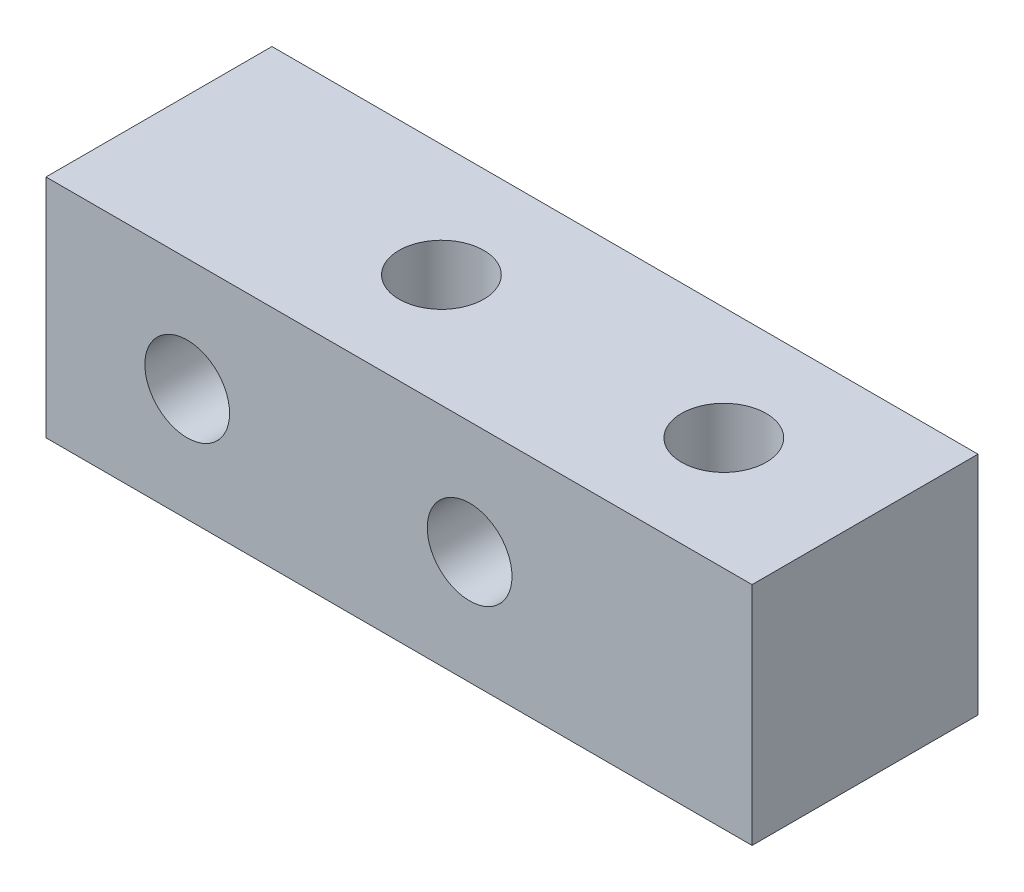
ISO-10303-21;
HEADER;
FILE_DESCRIPTION(('STEP AP214'),'2;1');
FILE_NAME('part.step','',(''),(''),'','','');
FILE_SCHEMA(('AUTOMOTIVE_DESIGN { 1 0 10303 214 1 1 1 1 }'));
ENDSEC;
DATA;
#1=APPLICATION_CONTEXT('core data for automotive mechanical design processes');
#2=APPLICATION_PROTOCOL_DEFINITION('international standard','automotive_design',2000,#1);
#3=PRODUCT_CONTEXT('',#1,'mechanical');
#4=PRODUCT('Part','Part','',(#3));
#5=PRODUCT_RELATED_PRODUCT_CATEGORY('part','',(#4));
#6=PRODUCT_DEFINITION_FORMATION('','',#4);
#7=PRODUCT_DEFINITION_CONTEXT('part definition',#1,'design');
#8=PRODUCT_DEFINITION('design','',#6,#7);
#9=PRODUCT_DEFINITION_SHAPE('','',#8);
#10=(LENGTH_UNIT() NAMED_UNIT(*) SI_UNIT(.MILLI.,.METRE.));
#11=(NAMED_UNIT(*) PLANE_ANGLE_UNIT() SI_UNIT($,.RADIAN.));
#12=(NAMED_UNIT(*) SI_UNIT($,.STERADIAN.) SOLID_ANGLE_UNIT());
#13=UNCERTAINTY_MEASURE_WITH_UNIT(LENGTH_MEASURE(1.E-05),#10,'distance_accuracy_value','');
#14=(GEOMETRIC_REPRESENTATION_CONTEXT(3) GLOBAL_UNCERTAINTY_ASSIGNED_CONTEXT((#13)) GLOBAL_UNIT_ASSIGNED_CONTEXT((#10,
#11,#12)) REPRESENTATION_CONTEXT('',''));
#15=CARTESIAN_POINT('',(0.,0.,0.));
#16=DIRECTION('',(0.,0.,1.));
#17=DIRECTION('',(1.,0.,0.));
#18=AXIS2_PLACEMENT_3D('',#15,#16,#17);
#19=CARTESIAN_POINT('',(12.5,8.,4.));
#20=DIRECTION('',(-1.,0.,0.));
#21=DIRECTION('',(0.,0.,1.));
#22=AXIS2_PLACEMENT_3D('',#19,#20,#21);
#23=PLANE('',#22);
#24=DIRECTION('',(0.,0.,-1.));
#25=VECTOR('',#24,1.);
#26=CARTESIAN_POINT('',(12.5,0.,4.));
#27=LINE('',#26,#25);
#28=CARTESIAN_POINT('',(12.5,0.,4.));
#29=VERTEX_POINT('',#28);
#30=CARTESIAN_POINT('',(12.5,0.,-4.));
#31=VERTEX_POINT('',#30);
#32=EDGE_CURVE('E110',#29,#31,#27,.T.);
#33=ORIENTED_EDGE('',*,*,#32,.T.);
#34=DIRECTION('',(0.,-1.,0.));
#35=VECTOR('',#34,1.);
#36=CARTESIAN_POINT('',(12.5,8.,-4.));
#37=LINE('',#36,#35);
#38=CARTESIAN_POINT('',(12.5,8.,-4.));
#39=VERTEX_POINT('',#38);
#40=EDGE_CURVE('E11',#39,#31,#37,.T.);
#41=ORIENTED_EDGE('',*,*,#40,.F.);
#42=DIRECTION('',(0.,0.,-1.));
#43=VECTOR('',#42,1.);
#44=CARTESIAN_POINT('',(12.5,8.,4.));
#45=LINE('',#44,#43);
#46=CARTESIAN_POINT('',(12.5,8.,4.));
#47=VERTEX_POINT('',#46);
#48=EDGE_CURVE('E94',#47,#39,#45,.T.);
#49=ORIENTED_EDGE('',*,*,#48,.F.);
#50=DIRECTION('',(0.,-1.,0.));
#51=VECTOR('',#50,1.);
#52=CARTESIAN_POINT('',(12.5,8.,4.));
#53=LINE('',#52,#51);
#54=EDGE_CURVE('E106',#47,#29,#53,.T.);
#55=ORIENTED_EDGE('',*,*,#54,.T.);
#56=EDGE_LOOP('',(#33,#41,#49,#55));
#57=FACE_BOUND('',#56,.T.);
#58=ADVANCED_FACE('F42',(#57),#23,.F.);
#59=CARTESIAN_POINT('',(-12.5,8.,-4.));
#60=DIRECTION('',(0.,0.,1.));
#61=DIRECTION('',(1.,0.,0.));
#62=AXIS2_PLACEMENT_3D('',#59,#60,#61);
#63=PLANE('',#62);
#64=CARTESIAN_POINT('',(-7.5,4.,-4.));
#65=DIRECTION('',(0.,0.,1.));
#66=DIRECTION('',(1.,0.,0.));
#67=AXIS2_PLACEMENT_3D('',#64,#65,#66);
#68=CIRCLE('',#67,1.5);
#69=CARTESIAN_POINT('',(-6.,4.,-4.));
#70=VERTEX_POINT('',#69);
#71=EDGE_CURVE('E140',#70,#70,#68,.F.);
#72=ORIENTED_EDGE('',*,*,#71,.F.);
#73=EDGE_LOOP('',(#72));
#74=FACE_BOUND('',#73,.T.);
#75=CARTESIAN_POINT('',(2.5,4.,-4.));
#76=DIRECTION('',(0.,0.,1.));
#77=DIRECTION('',(1.,0.,0.));
#78=AXIS2_PLACEMENT_3D('',#75,#76,#77);
#79=CIRCLE('',#78,1.5);
#80=CARTESIAN_POINT('',(4.,4.,-4.));
#81=VERTEX_POINT('',#80);
#82=EDGE_CURVE('E152',#81,#81,#79,.F.);
#83=ORIENTED_EDGE('',*,*,#82,.F.);
#84=EDGE_LOOP('',(#83));
#85=FACE_BOUND('',#84,.T.);
#86=DIRECTION('',(-1.,0.,0.));
#87=VECTOR('',#86,1.);
#88=CARTESIAN_POINT('',(-12.5,0.,-4.));
#89=LINE('',#88,#87);
#90=CARTESIAN_POINT('',(-12.5,0.,-4.));
#91=VERTEX_POINT('',#90);
#92=EDGE_CURVE('E99',#31,#91,#89,.T.);
#93=ORIENTED_EDGE('',*,*,#92,.T.);
#94=DIRECTION('',(0.,-1.,0.));
#95=VECTOR('',#94,1.);
#96=CARTESIAN_POINT('',(-12.5,8.,-4.));
#97=LINE('',#96,#95);
#98=CARTESIAN_POINT('',(-12.5,8.,-4.));
#99=VERTEX_POINT('',#98);
#100=EDGE_CURVE('E51',#99,#91,#97,.T.);
#101=ORIENTED_EDGE('',*,*,#100,.F.);
#102=DIRECTION('',(-1.,0.,0.));
#103=VECTOR('',#102,1.);
#104=CARTESIAN_POINT('',(-12.5,8.,-4.));
#105=LINE('',#104,#103);
#106=EDGE_CURVE('E89',#39,#99,#105,.T.);
#107=ORIENTED_EDGE('',*,*,#106,.F.);
#108=ORIENTED_EDGE('',*,*,#40,.T.);
#109=EDGE_LOOP('',(#93,#101,#107,#108));
#110=FACE_BOUND('',#109,.T.);
#111=ADVANCED_FACE('F98',(#74,#85,#110),#63,.F.);
#112=CARTESIAN_POINT('',(-12.5,8.,4.));
#113=DIRECTION('',(1.,0.,0.));
#114=DIRECTION('',(0.,0.,-1.));
#115=AXIS2_PLACEMENT_3D('',#112,#113,#114);
#116=PLANE('',#115);
#117=DIRECTION('',(0.,0.,1.));
#118=VECTOR('',#117,1.);
#119=CARTESIAN_POINT('',(-12.5,0.,4.));
#120=LINE('',#119,#118);
#121=CARTESIAN_POINT('',(-12.5,0.,4.));
#122=VERTEX_POINT('',#121);
#123=EDGE_CURVE('E76',#91,#122,#120,.T.);
#124=ORIENTED_EDGE('',*,*,#123,.T.);
#125=DIRECTION('',(0.,-1.,0.));
#126=VECTOR('',#125,1.);
#127=CARTESIAN_POINT('',(-12.5,8.,4.));
#128=LINE('',#127,#126);
#129=CARTESIAN_POINT('',(-12.5,8.,4.));
#130=VERTEX_POINT('',#129);
#131=EDGE_CURVE('E101',#130,#122,#128,.T.);
#132=ORIENTED_EDGE('',*,*,#131,.F.);
#133=DIRECTION('',(0.,0.,1.));
#134=VECTOR('',#133,1.);
#135=CARTESIAN_POINT('',(-12.5,8.,4.));
#136=LINE('',#135,#134);
#137=EDGE_CURVE('E92',#99,#130,#136,.T.);
#138=ORIENTED_EDGE('',*,*,#137,.F.);
#139=ORIENTED_EDGE('',*,*,#100,.T.);
#140=EDGE_LOOP('',(#124,#132,#138,#139));
#141=FACE_BOUND('',#140,.T.);
#142=ADVANCED_FACE('F102',(#141),#116,.F.);
#143=CARTESIAN_POINT('',(-12.5,8.,4.));
#144=DIRECTION('',(0.,0.,-1.));
#145=DIRECTION('',(-1.,0.,0.));
#146=AXIS2_PLACEMENT_3D('',#143,#144,#145);
#147=PLANE('',#146);
#148=CARTESIAN_POINT('',(-7.5,4.,4.));
#149=DIRECTION('',(0.,0.,1.));
#150=DIRECTION('',(1.,0.,0.));
#151=AXIS2_PLACEMENT_3D('',#148,#149,#150);
#152=CIRCLE('',#151,1.5);
#153=CARTESIAN_POINT('',(-6.,4.,4.));
#154=VERTEX_POINT('',#153);
#155=EDGE_CURVE('E151',#154,#154,#152,.T.);
#156=ORIENTED_EDGE('',*,*,#155,.F.);
#157=EDGE_LOOP('',(#156));
#158=FACE_BOUND('',#157,.T.);
#159=CARTESIAN_POINT('',(2.5,4.,4.));
#160=DIRECTION('',(0.,0.,1.));
#161=DIRECTION('',(1.,0.,0.));
#162=AXIS2_PLACEMENT_3D('',#159,#160,#161);
#163=CIRCLE('',#162,1.5);
#164=CARTESIAN_POINT('',(4.,4.,4.));
#165=VERTEX_POINT('',#164);
#166=EDGE_CURVE('E147',#165,#165,#163,.T.);
#167=ORIENTED_EDGE('',*,*,#166,.F.);
#168=EDGE_LOOP('',(#167));
#169=FACE_BOUND('',#168,.T.);
#170=DIRECTION('',(1.,0.,0.));
#171=VECTOR('',#170,1.);
#172=CARTESIAN_POINT('',(-12.5,0.,4.));
#173=LINE('',#172,#171);
#174=EDGE_CURVE('E82',#122,#29,#173,.T.);
#175=ORIENTED_EDGE('',*,*,#174,.T.);
#176=ORIENTED_EDGE('',*,*,#54,.F.);
#177=DIRECTION('',(1.,0.,0.));
#178=VECTOR('',#177,1.);
#179=CARTESIAN_POINT('',(-12.5,8.,4.));
#180=LINE('',#179,#178);
#181=EDGE_CURVE('E59',#130,#47,#180,.T.);
#182=ORIENTED_EDGE('',*,*,#181,.F.);
#183=ORIENTED_EDGE('',*,*,#131,.T.);
#184=EDGE_LOOP('',(#175,#176,#182,#183));
#185=FACE_BOUND('',#184,.T.);
#186=ADVANCED_FACE('F124',(#158,#169,#185),#147,.F.);
#187=CARTESIAN_POINT('',(0.,8.,0.));
#188=DIRECTION('',(0.,-1.,0.));
#189=DIRECTION('',(0.,0.,-1.));
#190=AXIS2_PLACEMENT_3D('',#187,#188,#189);
#191=PLANE('',#190);
#192=CARTESIAN_POINT('',(7.5,8.,0.));
#193=DIRECTION('',(0.,1.,0.));
#194=DIRECTION('',(0.,0.,1.));
#195=AXIS2_PLACEMENT_3D('',#192,#193,#194);
#196=CIRCLE('',#195,1.5);
#197=CARTESIAN_POINT('',(7.5,8.,1.5));
#198=VERTEX_POINT('',#197);
#199=EDGE_CURVE('E135',#198,#198,#196,.T.);
#200=ORIENTED_EDGE('',*,*,#199,.F.);
#201=EDGE_LOOP('',(#200));
#202=FACE_BOUND('',#201,.T.);
#203=CARTESIAN_POINT('',(-2.5,8.,0.));
#204=DIRECTION('',(0.,1.,0.));
#205=DIRECTION('',(0.,0.,1.));
#206=AXIS2_PLACEMENT_3D('',#203,#204,#205);
#207=CIRCLE('',#206,1.5);
#208=CARTESIAN_POINT('',(-2.5,8.,1.5));
#209=VERTEX_POINT('',#208);
#210=EDGE_CURVE('E131',#209,#209,#207,.T.);
#211=ORIENTED_EDGE('',*,*,#210,.F.);
#212=EDGE_LOOP('',(#211));
#213=FACE_BOUND('',#212,.T.);
#214=ORIENTED_EDGE('',*,*,#48,.T.);
#215=ORIENTED_EDGE('',*,*,#106,.T.);
#216=ORIENTED_EDGE('',*,*,#137,.T.);
#217=ORIENTED_EDGE('',*,*,#181,.T.);
#218=EDGE_LOOP('',(#214,#215,#216,#217));
#219=FACE_BOUND('',#218,.T.);
#220=ADVANCED_FACE('F90',(#202,#213,#219),#191,.F.);
#221=CARTESIAN_POINT('',(0.,0.,0.));
#222=DIRECTION('',(0.,-1.,0.));
#223=DIRECTION('',(0.,0.,-1.));
#224=AXIS2_PLACEMENT_3D('',#221,#222,#223);
#225=PLANE('',#224);
#226=CARTESIAN_POINT('',(7.5,0.,0.));
#227=DIRECTION('',(0.,-1.,0.));
#228=DIRECTION('',(0.,0.,-1.));
#229=AXIS2_PLACEMENT_3D('',#226,#227,#228);
#230=CIRCLE('',#229,1.5);
#231=CARTESIAN_POINT('',(7.5,0.,1.5));
#232=VERTEX_POINT('',#231);
#233=EDGE_CURVE('E114',#232,#232,#230,.F.);
#234=ORIENTED_EDGE('',*,*,#233,.T.);
#235=EDGE_LOOP('',(#234));
#236=FACE_BOUND('',#235,.T.);
#237=CARTESIAN_POINT('',(-2.5,0.,0.));
#238=DIRECTION('',(0.,-1.,0.));
#239=DIRECTION('',(0.,0.,-1.));
#240=AXIS2_PLACEMENT_3D('',#237,#238,#239);
#241=CIRCLE('',#240,1.5);
#242=CARTESIAN_POINT('',(-2.5,0.,1.5));
#243=VERTEX_POINT('',#242);
#244=EDGE_CURVE('E136',#243,#243,#241,.F.);
#245=ORIENTED_EDGE('',*,*,#244,.T.);
#246=EDGE_LOOP('',(#245));
#247=FACE_BOUND('',#246,.T.);
#248=ORIENTED_EDGE('',*,*,#32,.F.);
#249=ORIENTED_EDGE('',*,*,#174,.F.);
#250=ORIENTED_EDGE('',*,*,#123,.F.);
#251=ORIENTED_EDGE('',*,*,#92,.F.);
#252=EDGE_LOOP('',(#248,#249,#250,#251));
#253=FACE_BOUND('',#252,.T.);
#254=ADVANCED_FACE('F127',(#236,#247,#253),#225,.T.);
#255=CARTESIAN_POINT('',(-2.5,-4.24264068711929,0.));
#256=DIRECTION('',(0.,1.,0.));
#257=DIRECTION('',(0.,0.,1.));
#258=AXIS2_PLACEMENT_3D('',#255,#256,#257);
#259=CYLINDRICAL_SURFACE('',#258,1.5);
#260=CARTESIAN_POINT('',(-2.5,8.,1.5));
#261=CARTESIAN_POINT('',(-2.5,7.91666666666667,1.5));
#262=CARTESIAN_POINT('',(-2.5,7.83333333333333,1.5));
#263=CARTESIAN_POINT('',(-2.5,7.66666666666666,1.5));
#264=CARTESIAN_POINT('',(-2.5,7.58333333333333,1.5));
#265=CARTESIAN_POINT('',(-2.5,7.41666666666666,1.5));
#266=CARTESIAN_POINT('',(-2.5,7.33333333333333,1.5));
#267=CARTESIAN_POINT('',(-2.5,7.16666666666667,1.5));
#268=CARTESIAN_POINT('',(-2.5,7.08333333333333,1.5));
#269=CARTESIAN_POINT('',(-2.5,6.91666666666667,1.5));
#270=CARTESIAN_POINT('',(-2.5,6.83333333333333,1.5));
#271=CARTESIAN_POINT('',(-2.5,6.66666666666667,1.5));
#272=CARTESIAN_POINT('',(-2.5,6.58333333333333,1.5));
#273=CARTESIAN_POINT('',(-2.5,6.41666666666667,1.5));
#274=CARTESIAN_POINT('',(-2.5,6.33333333333333,1.5));
#275=CARTESIAN_POINT('',(-2.5,6.16666666666667,1.5));
#276=CARTESIAN_POINT('',(-2.5,6.08333333333333,1.5));
#277=CARTESIAN_POINT('',(-2.5,5.91666666666667,1.5));
#278=CARTESIAN_POINT('',(-2.5,5.83333333333333,1.5));
#279=CARTESIAN_POINT('',(-2.5,5.66666666666667,1.5));
#280=CARTESIAN_POINT('',(-2.5,5.58333333333333,1.5));
#281=CARTESIAN_POINT('',(-2.5,5.41666666666667,1.5));
#282=CARTESIAN_POINT('',(-2.5,5.33333333333333,1.5));
#283=CARTESIAN_POINT('',(-2.5,5.16666666666667,1.5));
#284=CARTESIAN_POINT('',(-2.5,5.08333333333333,1.5));
#285=CARTESIAN_POINT('',(-2.5,4.91666666666667,1.5));
#286=CARTESIAN_POINT('',(-2.5,4.83333333333333,1.5));
#287=CARTESIAN_POINT('',(-2.5,4.66666666666667,1.5));
#288=CARTESIAN_POINT('',(-2.5,4.58333333333333,1.5));
#289=CARTESIAN_POINT('',(-2.5,4.41666666666667,1.5));
#290=CARTESIAN_POINT('',(-2.5,4.33333333333333,1.5));
#291=CARTESIAN_POINT('',(-2.5,4.16666666666667,1.5));
#292=CARTESIAN_POINT('',(-2.5,4.08333333333333,1.5));
#293=CARTESIAN_POINT('',(-2.5,3.91666666666666,1.5));
#294=CARTESIAN_POINT('',(-2.5,3.83333333333333,1.5));
#295=CARTESIAN_POINT('',(-2.5,3.66666666666667,1.5));
#296=CARTESIAN_POINT('',(-2.5,3.58333333333333,1.5));
#297=CARTESIAN_POINT('',(-2.5,3.41666666666667,1.5));
#298=CARTESIAN_POINT('',(-2.5,3.33333333333333,1.5));
#299=CARTESIAN_POINT('',(-2.5,3.16666666666667,1.5));
#300=CARTESIAN_POINT('',(-2.5,3.08333333333333,1.5));
#301=CARTESIAN_POINT('',(-2.5,2.91666666666667,1.5));
#302=CARTESIAN_POINT('',(-2.5,2.83333333333333,1.5));
#303=CARTESIAN_POINT('',(-2.5,2.66666666666667,1.5));
#304=CARTESIAN_POINT('',(-2.5,2.58333333333333,1.5));
#305=CARTESIAN_POINT('',(-2.5,2.41666666666667,1.5));
#306=CARTESIAN_POINT('',(-2.5,2.33333333333333,1.5));
#307=CARTESIAN_POINT('',(-2.5,2.16666666666667,1.5));
#308=CARTESIAN_POINT('',(-2.5,2.08333333333333,1.5));
#309=CARTESIAN_POINT('',(-2.5,1.91666666666667,1.5));
#310=CARTESIAN_POINT('',(-2.5,1.83333333333333,1.5));
#311=CARTESIAN_POINT('',(-2.5,1.66666666666667,1.5));
#312=CARTESIAN_POINT('',(-2.5,1.58333333333333,1.5));
#313=CARTESIAN_POINT('',(-2.5,1.41666666666667,1.5));
#314=CARTESIAN_POINT('',(-2.5,1.33333333333333,1.5));
#315=CARTESIAN_POINT('',(-2.5,1.16666666666667,1.5));
#316=CARTESIAN_POINT('',(-2.5,1.08333333333333,1.5));
#317=CARTESIAN_POINT('',(-2.5,0.916666666666668,1.5));
#318=CARTESIAN_POINT('',(-2.5,0.833333333333334,1.5));
#319=CARTESIAN_POINT('',(-2.5,0.666666666666667,1.5));
#320=CARTESIAN_POINT('',(-2.5,0.583333333333334,1.5));
#321=CARTESIAN_POINT('',(-2.5,0.416666666666667,1.5));
#322=CARTESIAN_POINT('',(-2.5,0.333333333333334,1.5));
#323=CARTESIAN_POINT('',(-2.5,0.166666666666668,1.5));
#324=CARTESIAN_POINT('',(-2.5,0.0833333333333342,1.5));
#325=CARTESIAN_POINT('',(-2.5,0.,1.5));
#326=B_SPLINE_CURVE_WITH_KNOTS('',3,(#260,#261,#262,#263,#264,#265,#266,#267,#268,#269,#270,
#271,#272,#273,#274,#275,#276,#277,#278,#279,#280,#281,#282,#283,#284,#285,#286,#287,#288,#289,
#290,#291,#292,#293,#294,#295,#296,#297,#298,#299,#300,#301,#302,#303,#304,#305,#306,#307,#308,
#309,#310,#311,#312,#313,#314,#315,#316,#317,#318,#319,#320,#321,#322,#323,#324,#325),
.UNSPECIFIED.,.F.,.F.,(4,2,2,2,2,2,2,2,2,2,2,2,2,2,2,2,2,2,2,2,2,2,2,2,2,2,2,2,2,2,2,2,4),(0.,
0.25,0.5,0.750000000000001,0.999999999999999,1.25,1.5,1.75,2.,2.25,2.5,2.75,3.,3.25,3.5,3.75,4.,
4.25,4.5,4.75,5.,5.25,5.5,5.75,6.,6.25,6.5,6.75,7.,7.25,7.5,7.75,8.),.UNSPECIFIED.);
#327=EDGE_CURVE('BSEAM181',#209,#243,#326,.T.);
#328=ORIENTED_EDGE('',*,*,#210,.T.);
#329=ORIENTED_EDGE('',*,*,#244,.F.);
#330=ORIENTED_EDGE('',*,*,#327,.T.);
#331=ORIENTED_EDGE('',*,*,#327,.F.);
#332=EDGE_LOOP('',(#328,#330,#329,#331));
#333=FACE_BOUND('',#332,.T.);
#334=ADVANCED_FACE('F181',(#333),#259,.F.);
#335=CARTESIAN_POINT('',(7.5,-4.24264068711929,0.));
#336=DIRECTION('',(0.,1.,0.));
#337=DIRECTION('',(0.,0.,1.));
#338=AXIS2_PLACEMENT_3D('',#335,#336,#337);
#339=CYLINDRICAL_SURFACE('',#338,1.5);
#340=CARTESIAN_POINT('',(7.5,8.,1.5));
#341=CARTESIAN_POINT('',(7.5,7.91666666666667,1.5));
#342=CARTESIAN_POINT('',(7.5,7.83333333333333,1.5));
#343=CARTESIAN_POINT('',(7.5,7.66666666666666,1.5));
#344=CARTESIAN_POINT('',(7.5,7.58333333333333,1.5));
#345=CARTESIAN_POINT('',(7.5,7.41666666666666,1.5));
#346=CARTESIAN_POINT('',(7.5,7.33333333333333,1.5));
#347=CARTESIAN_POINT('',(7.5,7.16666666666667,1.5));
#348=CARTESIAN_POINT('',(7.5,7.08333333333333,1.5));
#349=CARTESIAN_POINT('',(7.5,6.91666666666667,1.5));
#350=CARTESIAN_POINT('',(7.5,6.83333333333333,1.5));
#351=CARTESIAN_POINT('',(7.5,6.66666666666667,1.5));
#352=CARTESIAN_POINT('',(7.5,6.58333333333333,1.5));
#353=CARTESIAN_POINT('',(7.5,6.41666666666667,1.5));
#354=CARTESIAN_POINT('',(7.5,6.33333333333333,1.5));
#355=CARTESIAN_POINT('',(7.5,6.16666666666667,1.5));
#356=CARTESIAN_POINT('',(7.5,6.08333333333333,1.5));
#357=CARTESIAN_POINT('',(7.5,5.91666666666667,1.5));
#358=CARTESIAN_POINT('',(7.5,5.83333333333333,1.5));
#359=CARTESIAN_POINT('',(7.5,5.66666666666667,1.5));
#360=CARTESIAN_POINT('',(7.5,5.58333333333333,1.5));
#361=CARTESIAN_POINT('',(7.5,5.41666666666667,1.5));
#362=CARTESIAN_POINT('',(7.5,5.33333333333333,1.5));
#363=CARTESIAN_POINT('',(7.5,5.16666666666667,1.5));
#364=CARTESIAN_POINT('',(7.5,5.08333333333333,1.5));
#365=CARTESIAN_POINT('',(7.5,4.91666666666667,1.5));
#366=CARTESIAN_POINT('',(7.5,4.83333333333333,1.5));
#367=CARTESIAN_POINT('',(7.5,4.66666666666667,1.5));
#368=CARTESIAN_POINT('',(7.5,4.58333333333333,1.5));
#369=CARTESIAN_POINT('',(7.5,4.41666666666667,1.5));
#370=CARTESIAN_POINT('',(7.5,4.33333333333333,1.5));
#371=CARTESIAN_POINT('',(7.5,4.16666666666667,1.5));
#372=CARTESIAN_POINT('',(7.5,4.08333333333333,1.5));
#373=CARTESIAN_POINT('',(7.5,3.91666666666666,1.5));
#374=CARTESIAN_POINT('',(7.5,3.83333333333333,1.5));
#375=CARTESIAN_POINT('',(7.5,3.66666666666667,1.5));
#376=CARTESIAN_POINT('',(7.5,3.58333333333333,1.5));
#377=CARTESIAN_POINT('',(7.5,3.41666666666667,1.5));
#378=CARTESIAN_POINT('',(7.5,3.33333333333333,1.5));
#379=CARTESIAN_POINT('',(7.5,3.16666666666667,1.5));
#380=CARTESIAN_POINT('',(7.5,3.08333333333333,1.5));
#381=CARTESIAN_POINT('',(7.5,2.91666666666667,1.5));
#382=CARTESIAN_POINT('',(7.5,2.83333333333333,1.5));
#383=CARTESIAN_POINT('',(7.5,2.66666666666667,1.5));
#384=CARTESIAN_POINT('',(7.5,2.58333333333333,1.5));
#385=CARTESIAN_POINT('',(7.5,2.41666666666667,1.5));
#386=CARTESIAN_POINT('',(7.5,2.33333333333333,1.5));
#387=CARTESIAN_POINT('',(7.5,2.16666666666667,1.5));
#388=CARTESIAN_POINT('',(7.5,2.08333333333333,1.5));
#389=CARTESIAN_POINT('',(7.5,1.91666666666667,1.5));
#390=CARTESIAN_POINT('',(7.5,1.83333333333333,1.5));
#391=CARTESIAN_POINT('',(7.5,1.66666666666667,1.5));
#392=CARTESIAN_POINT('',(7.5,1.58333333333333,1.5));
#393=CARTESIAN_POINT('',(7.5,1.41666666666667,1.5));
#394=CARTESIAN_POINT('',(7.5,1.33333333333333,1.5));
#395=CARTESIAN_POINT('',(7.5,1.16666666666667,1.5));
#396=CARTESIAN_POINT('',(7.5,1.08333333333333,1.5));
#397=CARTESIAN_POINT('',(7.5,0.916666666666668,1.5));
#398=CARTESIAN_POINT('',(7.5,0.833333333333334,1.5));
#399=CARTESIAN_POINT('',(7.5,0.666666666666667,1.5));
#400=CARTESIAN_POINT('',(7.5,0.583333333333334,1.5));
#401=CARTESIAN_POINT('',(7.5,0.416666666666667,1.5));
#402=CARTESIAN_POINT('',(7.5,0.333333333333334,1.5));
#403=CARTESIAN_POINT('',(7.5,0.166666666666668,1.5));
#404=CARTESIAN_POINT('',(7.5,0.0833333333333342,1.5));
#405=CARTESIAN_POINT('',(7.5,0.,1.5));
#406=B_SPLINE_CURVE_WITH_KNOTS('',3,(#340,#341,#342,#343,#344,#345,#346,#347,#348,#349,#350,
#351,#352,#353,#354,#355,#356,#357,#358,#359,#360,#361,#362,#363,#364,#365,#366,#367,#368,#369,
#370,#371,#372,#373,#374,#375,#376,#377,#378,#379,#380,#381,#382,#383,#384,#385,#386,#387,#388,
#389,#390,#391,#392,#393,#394,#395,#396,#397,#398,#399,#400,#401,#402,#403,#404,#405),
.UNSPECIFIED.,.F.,.F.,(4,2,2,2,2,2,2,2,2,2,2,2,2,2,2,2,2,2,2,2,2,2,2,2,2,2,2,2,2,2,2,2,4),(0.,
0.25,0.5,0.750000000000001,0.999999999999999,1.25,1.5,1.75,2.,2.25,2.5,2.75,3.,3.25,3.5,3.75,4.,
4.25,4.5,4.75,5.,5.25,5.5,5.75,6.,6.25,6.5,6.75,7.,7.25,7.5,7.75,8.),.UNSPECIFIED.);
#407=EDGE_CURVE('BSEAM172',#198,#232,#406,.T.);
#408=ORIENTED_EDGE('',*,*,#199,.T.);
#409=ORIENTED_EDGE('',*,*,#233,.F.);
#410=ORIENTED_EDGE('',*,*,#407,.T.);
#411=ORIENTED_EDGE('',*,*,#407,.F.);
#412=EDGE_LOOP('',(#408,#410,#409,#411));
#413=FACE_BOUND('',#412,.T.);
#414=ADVANCED_FACE('F172',(#413),#339,.F.);
#415=CARTESIAN_POINT('',(2.5,4.,-8.24264068711929));
#416=DIRECTION('',(0.,0.,1.));
#417=DIRECTION('',(1.,0.,0.));
#418=AXIS2_PLACEMENT_3D('',#415,#416,#417);
#419=CYLINDRICAL_SURFACE('',#418,1.5);
#420=CARTESIAN_POINT('',(4.,4.,-4.));
#421=CARTESIAN_POINT('',(4.,4.,-3.91666666666667));
#422=CARTESIAN_POINT('',(4.,4.,-3.83333333333333));
#423=CARTESIAN_POINT('',(4.,4.,-3.66666666666667));
#424=CARTESIAN_POINT('',(4.,4.,-3.58333333333333));
#425=CARTESIAN_POINT('',(4.,4.,-3.41666666666667));
#426=CARTESIAN_POINT('',(4.,4.,-3.33333333333333));
#427=CARTESIAN_POINT('',(4.,4.,-3.16666666666667));
#428=CARTESIAN_POINT('',(4.,4.,-3.08333333333333));
#429=CARTESIAN_POINT('',(4.,4.,-2.91666666666667));
#430=CARTESIAN_POINT('',(4.,4.,-2.83333333333333));
#431=CARTESIAN_POINT('',(4.,4.,-2.66666666666667));
#432=CARTESIAN_POINT('',(4.,4.,-2.58333333333333));
#433=CARTESIAN_POINT('',(4.,4.,-2.41666666666667));
#434=CARTESIAN_POINT('',(4.,4.,-2.33333333333333));
#435=CARTESIAN_POINT('',(4.,4.,-2.16666666666667));
#436=CARTESIAN_POINT('',(4.,4.,-2.08333333333333));
#437=CARTESIAN_POINT('',(4.,4.,-1.91666666666667));
#438=CARTESIAN_POINT('',(4.,4.,-1.83333333333333));
#439=CARTESIAN_POINT('',(4.,4.,-1.66666666666667));
#440=CARTESIAN_POINT('',(4.,4.,-1.58333333333333));
#441=CARTESIAN_POINT('',(4.,4.,-1.41666666666667));
#442=CARTESIAN_POINT('',(4.,4.,-1.33333333333333));
#443=CARTESIAN_POINT('',(4.,4.,-1.16666666666667));
#444=CARTESIAN_POINT('',(4.,4.,-1.08333333333333));
#445=CARTESIAN_POINT('',(4.,4.,-0.916666666666668));
#446=CARTESIAN_POINT('',(4.,4.,-0.833333333333334));
#447=CARTESIAN_POINT('',(4.,4.,-0.666666666666668));
#448=CARTESIAN_POINT('',(4.,4.,-0.583333333333334));
#449=CARTESIAN_POINT('',(4.,4.,-0.416666666666668));
#450=CARTESIAN_POINT('',(4.,4.,-0.333333333333335));
#451=CARTESIAN_POINT('',(4.,4.,-0.166666666666669));
#452=CARTESIAN_POINT('',(4.,4.,-0.0833333333333351));
#453=CARTESIAN_POINT('',(4.,4.,0.0833333333333317));
#454=CARTESIAN_POINT('',(4.,4.,0.166666666666665));
#455=CARTESIAN_POINT('',(4.,4.,0.333333333333332));
#456=CARTESIAN_POINT('',(4.,4.,0.416666666666665));
#457=CARTESIAN_POINT('',(4.,4.,0.583333333333332));
#458=CARTESIAN_POINT('',(4.,4.,0.666666666666666));
#459=CARTESIAN_POINT('',(4.,4.,0.833333333333332));
#460=CARTESIAN_POINT('',(4.,4.,0.916666666666666));
#461=CARTESIAN_POINT('',(4.,4.,1.08333333333333));
#462=CARTESIAN_POINT('',(4.,4.,1.16666666666667));
#463=CARTESIAN_POINT('',(4.,4.,1.33333333333333));
#464=CARTESIAN_POINT('',(4.,4.,1.41666666666666));
#465=CARTESIAN_POINT('',(4.,4.,1.58333333333333));
#466=CARTESIAN_POINT('',(4.,4.,1.66666666666666));
#467=CARTESIAN_POINT('',(4.,4.,1.83333333333333));
#468=CARTESIAN_POINT('',(4.,4.,1.91666666666666));
#469=CARTESIAN_POINT('',(4.,4.,2.08333333333333));
#470=CARTESIAN_POINT('',(4.,4.,2.16666666666667));
#471=CARTESIAN_POINT('',(4.,4.,2.33333333333333));
#472=CARTESIAN_POINT('',(4.,4.,2.41666666666667));
#473=CARTESIAN_POINT('',(4.,4.,2.58333333333333));
#474=CARTESIAN_POINT('',(4.,4.,2.66666666666666));
#475=CARTESIAN_POINT('',(4.,4.,2.83333333333333));
#476=CARTESIAN_POINT('',(4.,4.,2.91666666666666));
#477=CARTESIAN_POINT('',(4.,4.,3.08333333333333));
#478=CARTESIAN_POINT('',(4.,4.,3.16666666666666));
#479=CARTESIAN_POINT('',(4.,4.,3.33333333333333));
#480=CARTESIAN_POINT('',(4.,4.,3.41666666666666));
#481=CARTESIAN_POINT('',(4.,4.,3.58333333333333));
#482=CARTESIAN_POINT('',(4.,4.,3.66666666666666));
#483=CARTESIAN_POINT('',(4.,4.,3.83333333333333));
#484=CARTESIAN_POINT('',(4.,4.,3.91666666666666));
#485=CARTESIAN_POINT('',(4.,4.,4.));
#486=B_SPLINE_CURVE_WITH_KNOTS('',3,(#420,#421,#422,#423,#424,#425,#426,#427,#428,#429,#430,
#431,#432,#433,#434,#435,#436,#437,#438,#439,#440,#441,#442,#443,#444,#445,#446,#447,#448,#449,
#450,#451,#452,#453,#454,#455,#456,#457,#458,#459,#460,#461,#462,#463,#464,#465,#466,#467,#468,
#469,#470,#471,#472,#473,#474,#475,#476,#477,#478,#479,#480,#481,#482,#483,#484,#485),
.UNSPECIFIED.,.F.,.F.,(4,2,2,2,2,2,2,2,2,2,2,2,2,2,2,2,2,2,2,2,2,2,2,2,2,2,2,2,2,2,2,2,4),(0.,
0.25,0.5,0.75,1.,1.25,1.5,1.75,2.,2.25,2.5,2.75,3.,3.25,3.5,3.75,4.,4.25,4.5,4.75,5.,5.25,5.5,
5.75,6.,6.25,6.5,6.75,7.,7.25,7.5,7.75,8.),.UNSPECIFIED.);
#487=EDGE_CURVE('BSEAM170',#81,#165,#486,.T.);
#488=ORIENTED_EDGE('',*,*,#82,.T.);
#489=ORIENTED_EDGE('',*,*,#166,.T.);
#490=ORIENTED_EDGE('',*,*,#487,.T.);
#491=ORIENTED_EDGE('',*,*,#487,.F.);
#492=EDGE_LOOP('',(#488,#490,#489,#491));
#493=FACE_BOUND('',#492,.T.);
#494=ADVANCED_FACE('F170',(#493),#419,.F.);
#495=CARTESIAN_POINT('',(-7.5,4.,-8.24264068711929));
#496=DIRECTION('',(0.,0.,1.));
#497=DIRECTION('',(1.,0.,0.));
#498=AXIS2_PLACEMENT_3D('',#495,#496,#497);
#499=CYLINDRICAL_SURFACE('',#498,1.5);
#500=CARTESIAN_POINT('',(-6.,4.,-4.));
#501=CARTESIAN_POINT('',(-6.,4.,-3.91666666666667));
#502=CARTESIAN_POINT('',(-6.,4.,-3.83333333333333));
#503=CARTESIAN_POINT('',(-6.,4.,-3.66666666666667));
#504=CARTESIAN_POINT('',(-6.,4.,-3.58333333333333));
#505=CARTESIAN_POINT('',(-6.,4.,-3.41666666666667));
#506=CARTESIAN_POINT('',(-6.,4.,-3.33333333333333));
#507=CARTESIAN_POINT('',(-6.,4.,-3.16666666666667));
#508=CARTESIAN_POINT('',(-6.,4.,-3.08333333333333));
#509=CARTESIAN_POINT('',(-6.,4.,-2.91666666666667));
#510=CARTESIAN_POINT('',(-6.,4.,-2.83333333333333));
#511=CARTESIAN_POINT('',(-6.,4.,-2.66666666666667));
#512=CARTESIAN_POINT('',(-6.,4.,-2.58333333333333));
#513=CARTESIAN_POINT('',(-6.,4.,-2.41666666666667));
#514=CARTESIAN_POINT('',(-6.,4.,-2.33333333333333));
#515=CARTESIAN_POINT('',(-6.,4.,-2.16666666666667));
#516=CARTESIAN_POINT('',(-6.,4.,-2.08333333333333));
#517=CARTESIAN_POINT('',(-6.,4.,-1.91666666666667));
#518=CARTESIAN_POINT('',(-6.,4.,-1.83333333333333));
#519=CARTESIAN_POINT('',(-6.,4.,-1.66666666666667));
#520=CARTESIAN_POINT('',(-6.,4.,-1.58333333333333));
#521=CARTESIAN_POINT('',(-6.,4.,-1.41666666666667));
#522=CARTESIAN_POINT('',(-6.,4.,-1.33333333333333));
#523=CARTESIAN_POINT('',(-6.,4.,-1.16666666666667));
#524=CARTESIAN_POINT('',(-6.,4.,-1.08333333333333));
#525=CARTESIAN_POINT('',(-6.,4.,-0.916666666666668));
#526=CARTESIAN_POINT('',(-6.,4.,-0.833333333333334));
#527=CARTESIAN_POINT('',(-6.,4.,-0.666666666666668));
#528=CARTESIAN_POINT('',(-6.,4.,-0.583333333333334));
#529=CARTESIAN_POINT('',(-6.,4.,-0.416666666666668));
#530=CARTESIAN_POINT('',(-6.,4.,-0.333333333333335));
#531=CARTESIAN_POINT('',(-6.,4.,-0.166666666666669));
#532=CARTESIAN_POINT('',(-6.,4.,-0.0833333333333351));
#533=CARTESIAN_POINT('',(-6.,4.,0.0833333333333317));
#534=CARTESIAN_POINT('',(-6.,4.,0.166666666666665));
#535=CARTESIAN_POINT('',(-6.,4.,0.333333333333332));
#536=CARTESIAN_POINT('',(-6.,4.,0.416666666666665));
#537=CARTESIAN_POINT('',(-6.,4.,0.583333333333332));
#538=CARTESIAN_POINT('',(-6.,4.,0.666666666666666));
#539=CARTESIAN_POINT('',(-6.,4.,0.833333333333332));
#540=CARTESIAN_POINT('',(-6.,4.,0.916666666666666));
#541=CARTESIAN_POINT('',(-6.,4.,1.08333333333333));
#542=CARTESIAN_POINT('',(-6.,4.,1.16666666666667));
#543=CARTESIAN_POINT('',(-6.,4.,1.33333333333333));
#544=CARTESIAN_POINT('',(-6.,4.,1.41666666666666));
#545=CARTESIAN_POINT('',(-6.,4.,1.58333333333333));
#546=CARTESIAN_POINT('',(-6.,4.,1.66666666666666));
#547=CARTESIAN_POINT('',(-6.,4.,1.83333333333333));
#548=CARTESIAN_POINT('',(-6.,4.,1.91666666666666));
#549=CARTESIAN_POINT('',(-6.,4.,2.08333333333333));
#550=CARTESIAN_POINT('',(-6.,4.,2.16666666666667));
#551=CARTESIAN_POINT('',(-6.,4.,2.33333333333333));
#552=CARTESIAN_POINT('',(-6.,4.,2.41666666666667));
#553=CARTESIAN_POINT('',(-6.,4.,2.58333333333333));
#554=CARTESIAN_POINT('',(-6.,4.,2.66666666666666));
#555=CARTESIAN_POINT('',(-6.,4.,2.83333333333333));
#556=CARTESIAN_POINT('',(-6.,4.,2.91666666666666));
#557=CARTESIAN_POINT('',(-6.,4.,3.08333333333333));
#558=CARTESIAN_POINT('',(-6.,4.,3.16666666666666));
#559=CARTESIAN_POINT('',(-6.,4.,3.33333333333333));
#560=CARTESIAN_POINT('',(-6.,4.,3.41666666666666));
#561=CARTESIAN_POINT('',(-6.,4.,3.58333333333333));
#562=CARTESIAN_POINT('',(-6.,4.,3.66666666666666));
#563=CARTESIAN_POINT('',(-6.,4.,3.83333333333333));
#564=CARTESIAN_POINT('',(-6.,4.,3.91666666666666));
#565=CARTESIAN_POINT('',(-6.,4.,4.));
#566=B_SPLINE_CURVE_WITH_KNOTS('',3,(#500,#501,#502,#503,#504,#505,#506,#507,#508,#509,#510,
#511,#512,#513,#514,#515,#516,#517,#518,#519,#520,#521,#522,#523,#524,#525,#526,#527,#528,#529,
#530,#531,#532,#533,#534,#535,#536,#537,#538,#539,#540,#541,#542,#543,#544,#545,#546,#547,#548,
#549,#550,#551,#552,#553,#554,#555,#556,#557,#558,#559,#560,#561,#562,#563,#564,#565),
.UNSPECIFIED.,.F.,.F.,(4,2,2,2,2,2,2,2,2,2,2,2,2,2,2,2,2,2,2,2,2,2,2,2,2,2,2,2,2,2,2,2,4),(0.,
0.25,0.5,0.75,1.,1.25,1.5,1.75,2.,2.25,2.5,2.75,3.,3.25,3.5,3.75,4.,4.25,4.5,4.75,5.,5.25,5.5,
5.75,6.,6.25,6.5,6.75,7.,7.25,7.5,7.75,8.),.UNSPECIFIED.);
#567=EDGE_CURVE('BSEAM163',#70,#154,#566,.T.);
#568=ORIENTED_EDGE('',*,*,#71,.T.);
#569=ORIENTED_EDGE('',*,*,#155,.T.);
#570=ORIENTED_EDGE('',*,*,#567,.T.);
#571=ORIENTED_EDGE('',*,*,#567,.F.);
#572=EDGE_LOOP('',(#568,#570,#569,#571));
#573=FACE_BOUND('',#572,.T.);
#574=ADVANCED_FACE('F163',(#573),#499,.F.);
#575=CLOSED_SHELL('',(#58,#111,#142,#186,#220,#254,#334,#414,#494,#574));
#576=MANIFOLD_SOLID_BREP('B2',#575);
#577=ADVANCED_BREP_SHAPE_REPRESENTATION('',(#18,#576),#14);
#578=SHAPE_DEFINITION_REPRESENTATION(#9,#577);
ENDSEC;
END-ISO-10303-21;
